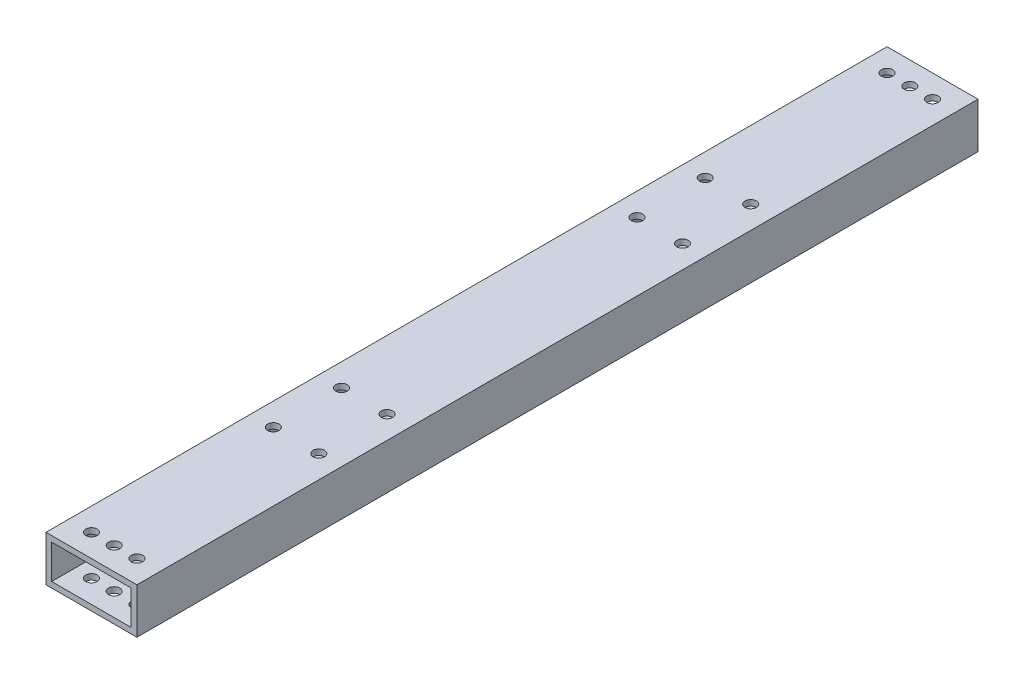
ISO-10303-21;
HEADER;
FILE_DESCRIPTION(('STEP AP214'),'2;1');
FILE_NAME('part.step','',(''),(''),'','','');
FILE_SCHEMA(('AUTOMOTIVE_DESIGN { 1 0 10303 214 1 1 1 1 }'));
ENDSEC;
DATA;
#1=APPLICATION_CONTEXT('core data for automotive mechanical design processes');
#2=APPLICATION_PROTOCOL_DEFINITION('international standard','automotive_design',2000,#1);
#3=PRODUCT_CONTEXT('',#1,'mechanical');
#4=PRODUCT('Part','Part','',(#3));
#5=PRODUCT_RELATED_PRODUCT_CATEGORY('part','',(#4));
#6=PRODUCT_DEFINITION_FORMATION('','',#4);
#7=PRODUCT_DEFINITION_CONTEXT('part definition',#1,'design');
#8=PRODUCT_DEFINITION('design','',#6,#7);
#9=PRODUCT_DEFINITION_SHAPE('','',#8);
#10=(LENGTH_UNIT() NAMED_UNIT(*) SI_UNIT(.MILLI.,.METRE.));
#11=(NAMED_UNIT(*) PLANE_ANGLE_UNIT() SI_UNIT($,.RADIAN.));
#12=(NAMED_UNIT(*) SI_UNIT($,.STERADIAN.) SOLID_ANGLE_UNIT());
#13=UNCERTAINTY_MEASURE_WITH_UNIT(LENGTH_MEASURE(1.E-05),#10,'distance_accuracy_value','');
#14=(GEOMETRIC_REPRESENTATION_CONTEXT(3) GLOBAL_UNCERTAINTY_ASSIGNED_CONTEXT((#13)) GLOBAL_UNIT_ASSIGNED_CONTEXT((#10,
#11,#12)) REPRESENTATION_CONTEXT('',''));
#15=CARTESIAN_POINT('',(0.,0.,0.));
#16=DIRECTION('',(0.,0.,1.));
#17=DIRECTION('',(1.,0.,0.));
#18=AXIS2_PLACEMENT_3D('',#15,#16,#17);
#19=CARTESIAN_POINT('',(0.,0.,469.9));
#20=DIRECTION('',(0.,0.,-1.));
#21=DIRECTION('',(-1.,0.,0.));
#22=AXIS2_PLACEMENT_3D('',#19,#20,#21);
#23=PLANE('',#22);
#24=DIRECTION('',(0.,-1.,0.));
#25=VECTOR('',#24,1.);
#26=CARTESIAN_POINT('',(0.,0.,469.9));
#27=LINE('',#26,#25);
#28=CARTESIAN_POINT('',(0.,25.4,469.9));
#29=VERTEX_POINT('',#28);
#30=CARTESIAN_POINT('',(0.,0.,469.9));
#31=VERTEX_POINT('',#30);
#32=EDGE_CURVE('E144',#29,#31,#27,.T.);
#33=ORIENTED_EDGE('',*,*,#32,.T.);
#34=DIRECTION('',(1.,0.,0.));
#35=VECTOR('',#34,1.);
#36=CARTESIAN_POINT('',(0.,0.,469.9));
#37=LINE('',#36,#35);
#38=CARTESIAN_POINT('',(50.8,0.,469.9));
#39=VERTEX_POINT('',#38);
#40=EDGE_CURVE('E147',#31,#39,#37,.T.);
#41=ORIENTED_EDGE('',*,*,#40,.T.);
#42=DIRECTION('',(0.,1.,0.));
#43=VECTOR('',#42,1.);
#44=CARTESIAN_POINT('',(50.8,0.,469.9));
#45=LINE('',#44,#43);
#46=CARTESIAN_POINT('',(50.8,25.4,469.9));
#47=VERTEX_POINT('',#46);
#48=EDGE_CURVE('E150',#39,#47,#45,.T.);
#49=ORIENTED_EDGE('',*,*,#48,.T.);
#50=DIRECTION('',(-1.,0.,0.));
#51=VECTOR('',#50,1.);
#52=CARTESIAN_POINT('',(0.,25.4,469.9));
#53=LINE('',#52,#51);
#54=EDGE_CURVE('E152',#47,#29,#53,.T.);
#55=ORIENTED_EDGE('',*,*,#54,.T.);
#56=EDGE_LOOP('',(#33,#41,#49,#55));
#57=FACE_BOUND('',#56,.T.);
#58=DIRECTION('',(0.,-1.,0.));
#59=VECTOR('',#58,1.);
#60=CARTESIAN_POINT('',(3.175,3.175,469.9));
#61=LINE('',#60,#59);
#62=CARTESIAN_POINT('',(3.175,22.225,469.9));
#63=VERTEX_POINT('',#62);
#64=CARTESIAN_POINT('',(3.175,3.175,469.9));
#65=VERTEX_POINT('',#64);
#66=EDGE_CURVE('E106',#63,#65,#61,.T.);
#67=ORIENTED_EDGE('',*,*,#66,.F.);
#68=DIRECTION('',(-1.,0.,0.));
#69=VECTOR('',#68,1.);
#70=CARTESIAN_POINT('',(3.175,22.225,469.9));
#71=LINE('',#70,#69);
#72=CARTESIAN_POINT('',(47.625,22.225,469.9));
#73=VERTEX_POINT('',#72);
#74=EDGE_CURVE('E128',#73,#63,#71,.T.);
#75=ORIENTED_EDGE('',*,*,#74,.F.);
#76=DIRECTION('',(0.,1.,0.));
#77=VECTOR('',#76,1.);
#78=CARTESIAN_POINT('',(47.625,3.175,469.9));
#79=LINE('',#78,#77);
#80=CARTESIAN_POINT('',(47.625,3.175,469.9));
#81=VERTEX_POINT('',#80);
#82=EDGE_CURVE('E126',#81,#73,#79,.T.);
#83=ORIENTED_EDGE('',*,*,#82,.F.);
#84=DIRECTION('',(1.,0.,0.));
#85=VECTOR('',#84,1.);
#86=CARTESIAN_POINT('',(3.175,3.175,469.9));
#87=LINE('',#86,#85);
#88=EDGE_CURVE('E114',#65,#81,#87,.T.);
#89=ORIENTED_EDGE('',*,*,#88,.F.);
#90=EDGE_LOOP('',(#67,#75,#83,#89));
#91=FACE_BOUND('',#90,.T.);
#92=ADVANCED_FACE('F39',(#57,#91),#23,.F.);
#93=CARTESIAN_POINT('',(0.,0.,0.));
#94=DIRECTION('',(0.,0.,-1.));
#95=DIRECTION('',(-1.,0.,0.));
#96=AXIS2_PLACEMENT_3D('',#93,#94,#95);
#97=PLANE('',#96);
#98=DIRECTION('',(0.,-1.,0.));
#99=VECTOR('',#98,1.);
#100=CARTESIAN_POINT('',(0.,0.,0.));
#101=LINE('',#100,#99);
#102=CARTESIAN_POINT('',(0.,25.4,0.));
#103=VERTEX_POINT('',#102);
#104=CARTESIAN_POINT('',(0.,0.,0.));
#105=VERTEX_POINT('',#104);
#106=EDGE_CURVE('E122',#103,#105,#101,.T.);
#107=ORIENTED_EDGE('',*,*,#106,.F.);
#108=DIRECTION('',(-1.,0.,0.));
#109=VECTOR('',#108,1.);
#110=CARTESIAN_POINT('',(0.,25.4,0.));
#111=LINE('',#110,#109);
#112=CARTESIAN_POINT('',(50.8,25.4,0.));
#113=VERTEX_POINT('',#112);
#114=EDGE_CURVE('E148',#113,#103,#111,.T.);
#115=ORIENTED_EDGE('',*,*,#114,.F.);
#116=DIRECTION('',(0.,1.,0.));
#117=VECTOR('',#116,1.);
#118=CARTESIAN_POINT('',(50.8,0.,0.));
#119=LINE('',#118,#117);
#120=CARTESIAN_POINT('',(50.8,0.,0.));
#121=VERTEX_POINT('',#120);
#122=EDGE_CURVE('E159',#121,#113,#119,.T.);
#123=ORIENTED_EDGE('',*,*,#122,.F.);
#124=DIRECTION('',(1.,0.,0.));
#125=VECTOR('',#124,1.);
#126=CARTESIAN_POINT('',(0.,0.,0.));
#127=LINE('',#126,#125);
#128=EDGE_CURVE('E157',#105,#121,#127,.T.);
#129=ORIENTED_EDGE('',*,*,#128,.F.);
#130=EDGE_LOOP('',(#107,#115,#123,#129));
#131=FACE_BOUND('',#130,.T.);
#132=DIRECTION('',(-1.,0.,0.));
#133=VECTOR('',#132,1.);
#134=CARTESIAN_POINT('',(3.175,22.225,0.));
#135=LINE('',#134,#133);
#136=CARTESIAN_POINT('',(47.625,22.225,0.));
#137=VERTEX_POINT('',#136);
#138=CARTESIAN_POINT('',(3.175,22.225,0.));
#139=VERTEX_POINT('',#138);
#140=EDGE_CURVE('E115',#137,#139,#135,.T.);
#141=ORIENTED_EDGE('',*,*,#140,.T.);
#142=DIRECTION('',(0.,-1.,0.));
#143=VECTOR('',#142,1.);
#144=CARTESIAN_POINT('',(3.175,3.175,0.));
#145=LINE('',#144,#143);
#146=CARTESIAN_POINT('',(3.175,3.175,0.));
#147=VERTEX_POINT('',#146);
#148=EDGE_CURVE('E64',#139,#147,#145,.T.);
#149=ORIENTED_EDGE('',*,*,#148,.T.);
#150=DIRECTION('',(1.,0.,0.));
#151=VECTOR('',#150,1.);
#152=CARTESIAN_POINT('',(3.175,3.175,0.));
#153=LINE('',#152,#151);
#154=CARTESIAN_POINT('',(47.625,3.175,0.));
#155=VERTEX_POINT('',#154);
#156=EDGE_CURVE('E121',#147,#155,#153,.T.);
#157=ORIENTED_EDGE('',*,*,#156,.T.);
#158=DIRECTION('',(0.,1.,0.));
#159=VECTOR('',#158,1.);
#160=CARTESIAN_POINT('',(47.625,3.175,0.));
#161=LINE('',#160,#159);
#162=EDGE_CURVE('E136',#155,#137,#161,.T.);
#163=ORIENTED_EDGE('',*,*,#162,.T.);
#164=EDGE_LOOP('',(#141,#149,#157,#163));
#165=FACE_BOUND('',#164,.T.);
#166=ADVANCED_FACE('F335',(#131,#165),#97,.T.);
#167=CARTESIAN_POINT('',(0.,0.,469.9));
#168=DIRECTION('',(1.,0.,0.));
#169=DIRECTION('',(0.,0.,-1.));
#170=AXIS2_PLACEMENT_3D('',#167,#168,#169);
#171=PLANE('',#170);
#172=ORIENTED_EDGE('',*,*,#106,.T.);
#173=DIRECTION('',(0.,0.,-1.));
#174=VECTOR('',#173,1.);
#175=CARTESIAN_POINT('',(0.,0.,469.9));
#176=LINE('',#175,#174);
#177=EDGE_CURVE('E11',#31,#105,#176,.T.);
#178=ORIENTED_EDGE('',*,*,#177,.F.);
#179=ORIENTED_EDGE('',*,*,#32,.F.);
#180=DIRECTION('',(0.,0.,-1.));
#181=VECTOR('',#180,1.);
#182=CARTESIAN_POINT('',(0.,25.4,469.9));
#183=LINE('',#182,#181);
#184=EDGE_CURVE('E154',#29,#103,#183,.T.);
#185=ORIENTED_EDGE('',*,*,#184,.T.);
#186=EDGE_LOOP('',(#172,#178,#179,#185));
#187=FACE_BOUND('',#186,.T.);
#188=ADVANCED_FACE('F41',(#187),#171,.F.);
#189=CARTESIAN_POINT('',(0.,0.,469.9));
#190=DIRECTION('',(0.,1.,0.));
#191=DIRECTION('',(0.,0.,1.));
#192=AXIS2_PLACEMENT_3D('',#189,#190,#191);
#193=PLANE('',#192);
#194=CARTESIAN_POINT('',(38.1,0.,114.3));
#195=DIRECTION('',(0.,1.,0.));
#196=DIRECTION('',(0.,0.,-1.));
#197=AXIS2_PLACEMENT_3D('',#194,#195,#196);
#198=CIRCLE('',#197,3.175);
#199=CARTESIAN_POINT('',(38.1,0.,111.125));
#200=VERTEX_POINT('',#199);
#201=EDGE_CURVE('E683',#200,#200,#198,.T.);
#202=ORIENTED_EDGE('',*,*,#201,.T.);
#203=EDGE_LOOP('',(#202));
#204=FACE_BOUND('',#203,.T.);
#205=CARTESIAN_POINT('',(12.7,0.,355.6));
#206=DIRECTION('',(0.,1.,0.));
#207=DIRECTION('',(0.,0.,1.));
#208=AXIS2_PLACEMENT_3D('',#205,#206,#207);
#209=CIRCLE('',#208,3.175);
#210=CARTESIAN_POINT('',(12.7,0.,358.775));
#211=VERTEX_POINT('',#210);
#212=EDGE_CURVE('E684',#211,#211,#209,.T.);
#213=ORIENTED_EDGE('',*,*,#212,.T.);
#214=EDGE_LOOP('',(#213));
#215=FACE_BOUND('',#214,.T.);
#216=CARTESIAN_POINT('',(12.7,0.,317.5));
#217=DIRECTION('',(0.,1.,0.));
#218=DIRECTION('',(0.,0.,1.));
#219=AXIS2_PLACEMENT_3D('',#216,#217,#218);
#220=CIRCLE('',#219,3.175);
#221=CARTESIAN_POINT('',(12.7,0.,320.675));
#222=VERTEX_POINT('',#221);
#223=EDGE_CURVE('E688',#222,#222,#220,.T.);
#224=ORIENTED_EDGE('',*,*,#223,.T.);
#225=EDGE_LOOP('',(#224));
#226=FACE_BOUND('',#225,.T.);
#227=CARTESIAN_POINT('',(12.7,0.,152.4));
#228=DIRECTION('',(0.,1.,0.));
#229=DIRECTION('',(0.,0.,1.));
#230=AXIS2_PLACEMENT_3D('',#227,#228,#229);
#231=CIRCLE('',#230,3.175);
#232=CARTESIAN_POINT('',(12.7,0.,155.575));
#233=VERTEX_POINT('',#232);
#234=EDGE_CURVE('E695',#233,#233,#231,.T.);
#235=ORIENTED_EDGE('',*,*,#234,.T.);
#236=EDGE_LOOP('',(#235));
#237=FACE_BOUND('',#236,.T.);
#238=CARTESIAN_POINT('',(38.1,0.,152.4));
#239=DIRECTION('',(0.,1.,0.));
#240=DIRECTION('',(0.,0.,-1.));
#241=AXIS2_PLACEMENT_3D('',#238,#239,#240);
#242=CIRCLE('',#241,3.175);
#243=CARTESIAN_POINT('',(38.1,0.,149.225));
#244=VERTEX_POINT('',#243);
#245=EDGE_CURVE('E685',#244,#244,#242,.T.);
#246=ORIENTED_EDGE('',*,*,#245,.T.);
#247=EDGE_LOOP('',(#246));
#248=FACE_BOUND('',#247,.T.);
#249=CARTESIAN_POINT('',(38.1000000000001,0.,317.5));
#250=DIRECTION('',(0.,1.,0.));
#251=DIRECTION('',(0.,0.,-1.));
#252=AXIS2_PLACEMENT_3D('',#249,#250,#251);
#253=CIRCLE('',#252,3.175);
#254=CARTESIAN_POINT('',(38.1000000000001,0.,314.325));
#255=VERTEX_POINT('',#254);
#256=EDGE_CURVE('E691',#255,#255,#253,.T.);
#257=ORIENTED_EDGE('',*,*,#256,.T.);
#258=EDGE_LOOP('',(#257));
#259=FACE_BOUND('',#258,.T.);
#260=CARTESIAN_POINT('',(38.1000000000001,0.,355.6));
#261=DIRECTION('',(0.,1.,0.));
#262=DIRECTION('',(0.,0.,-1.));
#263=AXIS2_PLACEMENT_3D('',#260,#261,#262);
#264=CIRCLE('',#263,3.175);
#265=CARTESIAN_POINT('',(38.1000000000001,0.,352.425));
#266=VERTEX_POINT('',#265);
#267=EDGE_CURVE('E784',#266,#266,#264,.T.);
#268=ORIENTED_EDGE('',*,*,#267,.T.);
#269=EDGE_LOOP('',(#268));
#270=FACE_BOUND('',#269,.T.);
#271=CARTESIAN_POINT('',(12.7,0.,114.3));
#272=DIRECTION('',(0.,1.,0.));
#273=DIRECTION('',(0.,0.,1.));
#274=AXIS2_PLACEMENT_3D('',#271,#272,#273);
#275=CIRCLE('',#274,3.175);
#276=CARTESIAN_POINT('',(12.7,0.,117.475));
#277=VERTEX_POINT('',#276);
#278=EDGE_CURVE('E197',#277,#277,#275,.T.);
#279=ORIENTED_EDGE('',*,*,#278,.T.);
#280=EDGE_LOOP('',(#279));
#281=FACE_BOUND('',#280,.T.);
#282=CARTESIAN_POINT('',(38.0999999999999,0.,12.6999999999999));
#283=DIRECTION('',(0.,1.,0.));
#284=DIRECTION('',(0.,0.,1.));
#285=AXIS2_PLACEMENT_3D('',#282,#283,#284);
#286=CIRCLE('',#285,3.175);
#287=CARTESIAN_POINT('',(38.0999999999999,0.,15.8749999999999));
#288=VERTEX_POINT('',#287);
#289=EDGE_CURVE('E251',#288,#288,#286,.T.);
#290=ORIENTED_EDGE('',*,*,#289,.T.);
#291=EDGE_LOOP('',(#290));
#292=FACE_BOUND('',#291,.T.);
#293=CARTESIAN_POINT('',(25.4,0.,457.2));
#294=DIRECTION('',(0.,1.,0.));
#295=DIRECTION('',(0.,0.,1.));
#296=AXIS2_PLACEMENT_3D('',#293,#294,#295);
#297=CIRCLE('',#296,3.175);
#298=CARTESIAN_POINT('',(25.4,0.,460.375));
#299=VERTEX_POINT('',#298);
#300=EDGE_CURVE('E258',#299,#299,#297,.T.);
#301=ORIENTED_EDGE('',*,*,#300,.T.);
#302=EDGE_LOOP('',(#301));
#303=FACE_BOUND('',#302,.T.);
#304=CARTESIAN_POINT('',(25.3999999999999,0.,12.6999999999999));
#305=DIRECTION('',(0.,1.,0.));
#306=DIRECTION('',(0.,0.,1.));
#307=AXIS2_PLACEMENT_3D('',#304,#305,#306);
#308=CIRCLE('',#307,3.175);
#309=CARTESIAN_POINT('',(25.3999999999999,0.,15.8749999999999));
#310=VERTEX_POINT('',#309);
#311=EDGE_CURVE('E257',#310,#310,#308,.T.);
#312=ORIENTED_EDGE('',*,*,#311,.T.);
#313=EDGE_LOOP('',(#312));
#314=FACE_BOUND('',#313,.T.);
#315=CARTESIAN_POINT('',(12.7,0.,457.2));
#316=DIRECTION('',(0.,1.,0.));
#317=DIRECTION('',(0.,0.,1.));
#318=AXIS2_PLACEMENT_3D('',#315,#316,#317);
#319=CIRCLE('',#318,3.175);
#320=CARTESIAN_POINT('',(12.7,0.,460.375));
#321=VERTEX_POINT('',#320);
#322=EDGE_CURVE('E270',#321,#321,#319,.T.);
#323=ORIENTED_EDGE('',*,*,#322,.T.);
#324=EDGE_LOOP('',(#323));
#325=FACE_BOUND('',#324,.T.);
#326=CARTESIAN_POINT('',(38.1,0.,457.2));
#327=DIRECTION('',(0.,1.,0.));
#328=DIRECTION('',(0.,0.,1.));
#329=AXIS2_PLACEMENT_3D('',#326,#327,#328);
#330=CIRCLE('',#329,3.175);
#331=CARTESIAN_POINT('',(38.1,0.,460.375));
#332=VERTEX_POINT('',#331);
#333=EDGE_CURVE('E247',#332,#332,#330,.T.);
#334=ORIENTED_EDGE('',*,*,#333,.T.);
#335=EDGE_LOOP('',(#334));
#336=FACE_BOUND('',#335,.T.);
#337=CARTESIAN_POINT('',(12.6999999999999,0.,12.6999999999999));
#338=DIRECTION('',(0.,1.,0.));
#339=DIRECTION('',(0.,0.,1.));
#340=AXIS2_PLACEMENT_3D('',#337,#338,#339);
#341=CIRCLE('',#340,3.175);
#342=CARTESIAN_POINT('',(12.6999999999999,0.,15.8749999999999));
#343=VERTEX_POINT('',#342);
#344=EDGE_CURVE('E173',#343,#343,#341,.T.);
#345=ORIENTED_EDGE('',*,*,#344,.T.);
#346=EDGE_LOOP('',(#345));
#347=FACE_BOUND('',#346,.T.);
#348=ORIENTED_EDGE('',*,*,#128,.T.);
#349=DIRECTION('',(0.,0.,-1.));
#350=VECTOR('',#349,1.);
#351=CARTESIAN_POINT('',(50.8,0.,469.9));
#352=LINE('',#351,#350);
#353=EDGE_CURVE('E48',#39,#121,#352,.T.);
#354=ORIENTED_EDGE('',*,*,#353,.F.);
#355=ORIENTED_EDGE('',*,*,#40,.F.);
#356=ORIENTED_EDGE('',*,*,#177,.T.);
#357=EDGE_LOOP('',(#348,#354,#355,#356));
#358=FACE_BOUND('',#357,.T.);
#359=ADVANCED_FACE('F321',(#204,#215,#226,#237,#248,#259,#270,#281,#292,#303,#314,#325,#336,
#347,#358),#193,.F.);
#360=CARTESIAN_POINT('',(50.8,0.,469.9));
#361=DIRECTION('',(-1.,0.,0.));
#362=DIRECTION('',(0.,0.,1.));
#363=AXIS2_PLACEMENT_3D('',#360,#361,#362);
#364=PLANE('',#363);
#365=ORIENTED_EDGE('',*,*,#122,.T.);
#366=DIRECTION('',(0.,0.,-1.));
#367=VECTOR('',#366,1.);
#368=CARTESIAN_POINT('',(50.8,25.4,469.9));
#369=LINE('',#368,#367);
#370=EDGE_CURVE('E164',#47,#113,#369,.T.);
#371=ORIENTED_EDGE('',*,*,#370,.F.);
#372=ORIENTED_EDGE('',*,*,#48,.F.);
#373=ORIENTED_EDGE('',*,*,#353,.T.);
#374=EDGE_LOOP('',(#365,#371,#372,#373));
#375=FACE_BOUND('',#374,.T.);
#376=ADVANCED_FACE('F324',(#375),#364,.F.);
#377=CARTESIAN_POINT('',(0.,25.4,469.9));
#378=DIRECTION('',(0.,-1.,0.));
#379=DIRECTION('',(0.,0.,-1.));
#380=AXIS2_PLACEMENT_3D('',#377,#378,#379);
#381=PLANE('',#380);
#382=CARTESIAN_POINT('',(38.1,25.4,114.3));
#383=DIRECTION('',(0.,-1.,0.));
#384=DIRECTION('',(0.,0.,-1.));
#385=AXIS2_PLACEMENT_3D('',#382,#383,#384);
#386=CIRCLE('',#385,3.175);
#387=CARTESIAN_POINT('',(38.1,25.4,111.125));
#388=VERTEX_POINT('',#387);
#389=EDGE_CURVE('E244',#388,#388,#386,.T.);
#390=ORIENTED_EDGE('',*,*,#389,.T.);
#391=EDGE_LOOP('',(#390));
#392=FACE_BOUND('',#391,.T.);
#393=CARTESIAN_POINT('',(12.7,25.4,355.6));
#394=DIRECTION('',(0.,-1.,0.));
#395=DIRECTION('',(0.,0.,-1.));
#396=AXIS2_PLACEMENT_3D('',#393,#394,#395);
#397=CIRCLE('',#396,3.175);
#398=CARTESIAN_POINT('',(12.7,25.4,352.425));
#399=VERTEX_POINT('',#398);
#400=EDGE_CURVE('E229',#399,#399,#397,.T.);
#401=ORIENTED_EDGE('',*,*,#400,.T.);
#402=EDGE_LOOP('',(#401));
#403=FACE_BOUND('',#402,.T.);
#404=CARTESIAN_POINT('',(12.7,25.4,317.5));
#405=DIRECTION('',(0.,-1.,0.));
#406=DIRECTION('',(0.,0.,-1.));
#407=AXIS2_PLACEMENT_3D('',#404,#405,#406);
#408=CIRCLE('',#407,3.175);
#409=CARTESIAN_POINT('',(12.7,25.4,314.325));
#410=VERTEX_POINT('',#409);
#411=EDGE_CURVE('E225',#410,#410,#408,.T.);
#412=ORIENTED_EDGE('',*,*,#411,.T.);
#413=EDGE_LOOP('',(#412));
#414=FACE_BOUND('',#413,.T.);
#415=CARTESIAN_POINT('',(12.7,25.4,152.4));
#416=DIRECTION('',(0.,-1.,0.));
#417=DIRECTION('',(0.,0.,-1.));
#418=AXIS2_PLACEMENT_3D('',#415,#416,#417);
#419=CIRCLE('',#418,3.175);
#420=CARTESIAN_POINT('',(12.7,25.4,149.225));
#421=VERTEX_POINT('',#420);
#422=EDGE_CURVE('E221',#421,#421,#419,.T.);
#423=ORIENTED_EDGE('',*,*,#422,.T.);
#424=EDGE_LOOP('',(#423));
#425=FACE_BOUND('',#424,.T.);
#426=CARTESIAN_POINT('',(38.1,25.4,152.4));
#427=DIRECTION('',(0.,-1.,0.));
#428=DIRECTION('',(0.,0.,-1.));
#429=AXIS2_PLACEMENT_3D('',#426,#427,#428);
#430=CIRCLE('',#429,3.175);
#431=CARTESIAN_POINT('',(38.1,25.4,149.225));
#432=VERTEX_POINT('',#431);
#433=EDGE_CURVE('E217',#432,#432,#430,.T.);
#434=ORIENTED_EDGE('',*,*,#433,.T.);
#435=EDGE_LOOP('',(#434));
#436=FACE_BOUND('',#435,.T.);
#437=CARTESIAN_POINT('',(38.1000000000001,25.4,317.5));
#438=DIRECTION('',(0.,-1.,0.));
#439=DIRECTION('',(0.,0.,-1.));
#440=AXIS2_PLACEMENT_3D('',#437,#438,#439);
#441=CIRCLE('',#440,3.175);
#442=CARTESIAN_POINT('',(38.1000000000001,25.4,314.325));
#443=VERTEX_POINT('',#442);
#444=EDGE_CURVE('E212',#443,#443,#441,.T.);
#445=ORIENTED_EDGE('',*,*,#444,.T.);
#446=EDGE_LOOP('',(#445));
#447=FACE_BOUND('',#446,.T.);
#448=CARTESIAN_POINT('',(38.1000000000001,25.4,355.6));
#449=DIRECTION('',(0.,-1.,0.));
#450=DIRECTION('',(0.,0.,-1.));
#451=AXIS2_PLACEMENT_3D('',#448,#449,#450);
#452=CIRCLE('',#451,3.175);
#453=CARTESIAN_POINT('',(38.1000000000001,25.4,352.425));
#454=VERTEX_POINT('',#453);
#455=EDGE_CURVE('E207',#454,#454,#452,.T.);
#456=ORIENTED_EDGE('',*,*,#455,.T.);
#457=EDGE_LOOP('',(#456));
#458=FACE_BOUND('',#457,.T.);
#459=CARTESIAN_POINT('',(12.7,25.4,114.3));
#460=DIRECTION('',(0.,-1.,0.));
#461=DIRECTION('',(0.,0.,-1.));
#462=AXIS2_PLACEMENT_3D('',#459,#460,#461);
#463=CIRCLE('',#462,3.175);
#464=CARTESIAN_POINT('',(12.7,25.4,111.125));
#465=VERTEX_POINT('',#464);
#466=EDGE_CURVE('E202',#465,#465,#463,.T.);
#467=ORIENTED_EDGE('',*,*,#466,.T.);
#468=EDGE_LOOP('',(#467));
#469=FACE_BOUND('',#468,.T.);
#470=CARTESIAN_POINT('',(38.0999999999999,25.4,12.6999999999999));
#471=DIRECTION('',(0.,1.,0.));
#472=DIRECTION('',(0.,0.,1.));
#473=AXIS2_PLACEMENT_3D('',#470,#471,#472);
#474=CIRCLE('',#473,3.175);
#475=CARTESIAN_POINT('',(38.0999999999999,25.4,15.8749999999999));
#476=VERTEX_POINT('',#475);
#477=EDGE_CURVE('E261',#476,#476,#474,.T.);
#478=ORIENTED_EDGE('',*,*,#477,.F.);
#479=EDGE_LOOP('',(#478));
#480=FACE_BOUND('',#479,.T.);
#481=CARTESIAN_POINT('',(25.4,25.4,457.2));
#482=DIRECTION('',(0.,1.,0.));
#483=DIRECTION('',(0.,0.,1.));
#484=AXIS2_PLACEMENT_3D('',#481,#482,#483);
#485=CIRCLE('',#484,3.175);
#486=CARTESIAN_POINT('',(25.4,25.4,460.375));
#487=VERTEX_POINT('',#486);
#488=EDGE_CURVE('E254',#487,#487,#485,.T.);
#489=ORIENTED_EDGE('',*,*,#488,.F.);
#490=EDGE_LOOP('',(#489));
#491=FACE_BOUND('',#490,.T.);
#492=CARTESIAN_POINT('',(25.3999999999999,25.4,12.6999999999999));
#493=DIRECTION('',(0.,1.,0.));
#494=DIRECTION('',(0.,0.,1.));
#495=AXIS2_PLACEMENT_3D('',#492,#493,#494);
#496=CIRCLE('',#495,3.175);
#497=CARTESIAN_POINT('',(25.3999999999999,25.4,15.8749999999999));
#498=VERTEX_POINT('',#497);
#499=EDGE_CURVE('E273',#498,#498,#496,.T.);
#500=ORIENTED_EDGE('',*,*,#499,.F.);
#501=EDGE_LOOP('',(#500));
#502=FACE_BOUND('',#501,.T.);
#503=CARTESIAN_POINT('',(12.7,25.4,457.2));
#504=DIRECTION('',(0.,1.,0.));
#505=DIRECTION('',(0.,0.,1.));
#506=AXIS2_PLACEMENT_3D('',#503,#504,#505);
#507=CIRCLE('',#506,3.175);
#508=CARTESIAN_POINT('',(12.7,25.4,460.375));
#509=VERTEX_POINT('',#508);
#510=EDGE_CURVE('E266',#509,#509,#507,.T.);
#511=ORIENTED_EDGE('',*,*,#510,.F.);
#512=EDGE_LOOP('',(#511));
#513=FACE_BOUND('',#512,.T.);
#514=CARTESIAN_POINT('',(38.1,25.4,457.2));
#515=DIRECTION('',(0.,1.,0.));
#516=DIRECTION('',(0.,0.,1.));
#517=AXIS2_PLACEMENT_3D('',#514,#515,#516);
#518=CIRCLE('',#517,3.175);
#519=CARTESIAN_POINT('',(38.1,25.4,460.375));
#520=VERTEX_POINT('',#519);
#521=EDGE_CURVE('E248',#520,#520,#518,.T.);
#522=ORIENTED_EDGE('',*,*,#521,.F.);
#523=EDGE_LOOP('',(#522));
#524=FACE_BOUND('',#523,.T.);
#525=CARTESIAN_POINT('',(12.6999999999999,25.4,12.6999999999999));
#526=DIRECTION('',(0.,1.,0.));
#527=DIRECTION('',(0.,0.,1.));
#528=AXIS2_PLACEMENT_3D('',#525,#526,#527);
#529=CIRCLE('',#528,3.175);
#530=CARTESIAN_POINT('',(12.6999999999999,25.4,15.8749999999999));
#531=VERTEX_POINT('',#530);
#532=EDGE_CURVE('E269',#531,#531,#529,.T.);
#533=ORIENTED_EDGE('',*,*,#532,.F.);
#534=EDGE_LOOP('',(#533));
#535=FACE_BOUND('',#534,.T.);
#536=ORIENTED_EDGE('',*,*,#114,.T.);
#537=ORIENTED_EDGE('',*,*,#184,.F.);
#538=ORIENTED_EDGE('',*,*,#54,.F.);
#539=ORIENTED_EDGE('',*,*,#370,.T.);
#540=EDGE_LOOP('',(#536,#537,#538,#539));
#541=FACE_BOUND('',#540,.T.);
#542=ADVANCED_FACE('F339',(#392,#403,#414,#425,#436,#447,#458,#469,#480,#491,#502,#513,#524,
#535,#541),#381,.F.);
#543=CARTESIAN_POINT('',(3.175,3.175,469.9));
#544=DIRECTION('',(1.,0.,0.));
#545=DIRECTION('',(0.,0.,-1.));
#546=AXIS2_PLACEMENT_3D('',#543,#544,#545);
#547=PLANE('',#546);
#548=ORIENTED_EDGE('',*,*,#148,.F.);
#549=DIRECTION('',(0.,0.,-1.));
#550=VECTOR('',#549,1.);
#551=CARTESIAN_POINT('',(3.175,22.225,469.9));
#552=LINE('',#551,#550);
#553=EDGE_CURVE('E110',#63,#139,#552,.T.);
#554=ORIENTED_EDGE('',*,*,#553,.F.);
#555=ORIENTED_EDGE('',*,*,#66,.T.);
#556=DIRECTION('',(0.,0.,-1.));
#557=VECTOR('',#556,1.);
#558=CARTESIAN_POINT('',(3.175,3.175,469.9));
#559=LINE('',#558,#557);
#560=EDGE_CURVE('E109',#65,#147,#559,.T.);
#561=ORIENTED_EDGE('',*,*,#560,.T.);
#562=EDGE_LOOP('',(#548,#554,#555,#561));
#563=FACE_BOUND('',#562,.T.);
#564=ADVANCED_FACE('F108',(#563),#547,.T.);
#565=CARTESIAN_POINT('',(3.175,3.175,469.9));
#566=DIRECTION('',(0.,1.,0.));
#567=DIRECTION('',(0.,0.,1.));
#568=AXIS2_PLACEMENT_3D('',#565,#566,#567);
#569=PLANE('',#568);
#570=CARTESIAN_POINT('',(38.1,3.175,114.3));
#571=DIRECTION('',(0.,1.,0.));
#572=DIRECTION('',(0.,0.,1.));
#573=AXIS2_PLACEMENT_3D('',#570,#571,#572);
#574=CIRCLE('',#573,3.175);
#575=CARTESIAN_POINT('',(38.1,3.175,117.475));
#576=VERTEX_POINT('',#575);
#577=EDGE_CURVE('E241',#576,#576,#574,.T.);
#578=ORIENTED_EDGE('',*,*,#577,.F.);
#579=EDGE_LOOP('',(#578));
#580=FACE_BOUND('',#579,.T.);
#581=CARTESIAN_POINT('',(12.7,3.175,355.6));
#582=DIRECTION('',(0.,1.,0.));
#583=DIRECTION('',(0.,0.,1.));
#584=AXIS2_PLACEMENT_3D('',#581,#582,#583);
#585=CIRCLE('',#584,3.175);
#586=CARTESIAN_POINT('',(12.7,3.175,358.775));
#587=VERTEX_POINT('',#586);
#588=EDGE_CURVE('E224',#587,#587,#585,.T.);
#589=ORIENTED_EDGE('',*,*,#588,.F.);
#590=EDGE_LOOP('',(#589));
#591=FACE_BOUND('',#590,.T.);
#592=CARTESIAN_POINT('',(12.7,3.175,317.5));
#593=DIRECTION('',(0.,1.,0.));
#594=DIRECTION('',(0.,0.,1.));
#595=AXIS2_PLACEMENT_3D('',#592,#593,#594);
#596=CIRCLE('',#595,3.175);
#597=CARTESIAN_POINT('',(12.7,3.175,320.675));
#598=VERTEX_POINT('',#597);
#599=EDGE_CURVE('E220',#598,#598,#596,.T.);
#600=ORIENTED_EDGE('',*,*,#599,.F.);
#601=EDGE_LOOP('',(#600));
#602=FACE_BOUND('',#601,.T.);
#603=CARTESIAN_POINT('',(12.7,3.175,152.4));
#604=DIRECTION('',(0.,1.,0.));
#605=DIRECTION('',(0.,0.,1.));
#606=AXIS2_PLACEMENT_3D('',#603,#604,#605);
#607=CIRCLE('',#606,3.175);
#608=CARTESIAN_POINT('',(12.7,3.175,155.575));
#609=VERTEX_POINT('',#608);
#610=EDGE_CURVE('E216',#609,#609,#607,.T.);
#611=ORIENTED_EDGE('',*,*,#610,.F.);
#612=EDGE_LOOP('',(#611));
#613=FACE_BOUND('',#612,.T.);
#614=CARTESIAN_POINT('',(38.1,3.175,152.4));
#615=DIRECTION('',(0.,1.,0.));
#616=DIRECTION('',(0.,0.,1.));
#617=AXIS2_PLACEMENT_3D('',#614,#615,#616);
#618=CIRCLE('',#617,3.175);
#619=CARTESIAN_POINT('',(38.1,3.175,155.575));
#620=VERTEX_POINT('',#619);
#621=EDGE_CURVE('E211',#620,#620,#618,.T.);
#622=ORIENTED_EDGE('',*,*,#621,.F.);
#623=EDGE_LOOP('',(#622));
#624=FACE_BOUND('',#623,.T.);
#625=CARTESIAN_POINT('',(38.1000000000001,3.175,317.5));
#626=DIRECTION('',(0.,1.,0.));
#627=DIRECTION('',(0.,0.,1.));
#628=AXIS2_PLACEMENT_3D('',#625,#626,#627);
#629=CIRCLE('',#628,3.175);
#630=CARTESIAN_POINT('',(38.1000000000001,3.175,320.675));
#631=VERTEX_POINT('',#630);
#632=EDGE_CURVE('E206',#631,#631,#629,.T.);
#633=ORIENTED_EDGE('',*,*,#632,.F.);
#634=EDGE_LOOP('',(#633));
#635=FACE_BOUND('',#634,.T.);
#636=CARTESIAN_POINT('',(38.1000000000001,3.175,355.6));
#637=DIRECTION('',(0.,1.,0.));
#638=DIRECTION('',(0.,0.,1.));
#639=AXIS2_PLACEMENT_3D('',#636,#637,#638);
#640=CIRCLE('',#639,3.175);
#641=CARTESIAN_POINT('',(38.1000000000001,3.175,358.775));
#642=VERTEX_POINT('',#641);
#643=EDGE_CURVE('E201',#642,#642,#640,.T.);
#644=ORIENTED_EDGE('',*,*,#643,.F.);
#645=EDGE_LOOP('',(#644));
#646=FACE_BOUND('',#645,.T.);
#647=CARTESIAN_POINT('',(12.7,3.175,114.3));
#648=DIRECTION('',(0.,1.,0.));
#649=DIRECTION('',(0.,0.,1.));
#650=AXIS2_PLACEMENT_3D('',#647,#648,#649);
#651=CIRCLE('',#650,3.175);
#652=CARTESIAN_POINT('',(12.7,3.175,117.475));
#653=VERTEX_POINT('',#652);
#654=EDGE_CURVE('E196',#653,#653,#651,.T.);
#655=ORIENTED_EDGE('',*,*,#654,.F.);
#656=EDGE_LOOP('',(#655));
#657=FACE_BOUND('',#656,.T.);
#658=CARTESIAN_POINT('',(38.0999999999999,3.175,12.6999999999999));
#659=DIRECTION('',(0.,1.,0.));
#660=DIRECTION('',(0.,0.,1.));
#661=AXIS2_PLACEMENT_3D('',#658,#659,#660);
#662=CIRCLE('',#661,3.175);
#663=CARTESIAN_POINT('',(38.0999999999999,3.175,15.8749999999999));
#664=VERTEX_POINT('',#663);
#665=EDGE_CURVE('E134',#664,#664,#662,.T.);
#666=ORIENTED_EDGE('',*,*,#665,.F.);
#667=EDGE_LOOP('',(#666));
#668=FACE_BOUND('',#667,.T.);
#669=CARTESIAN_POINT('',(25.4,3.175,457.2));
#670=DIRECTION('',(0.,1.,0.));
#671=DIRECTION('',(0.,0.,1.));
#672=AXIS2_PLACEMENT_3D('',#669,#670,#671);
#673=CIRCLE('',#672,3.175);
#674=CARTESIAN_POINT('',(25.4,3.175,460.375));
#675=VERTEX_POINT('',#674);
#676=EDGE_CURVE('E189',#675,#675,#673,.T.);
#677=ORIENTED_EDGE('',*,*,#676,.F.);
#678=EDGE_LOOP('',(#677));
#679=FACE_BOUND('',#678,.T.);
#680=CARTESIAN_POINT('',(25.3999999999999,3.175,12.6999999999999));
#681=DIRECTION('',(0.,1.,0.));
#682=DIRECTION('',(0.,0.,1.));
#683=AXIS2_PLACEMENT_3D('',#680,#681,#682);
#684=CIRCLE('',#683,3.175);
#685=CARTESIAN_POINT('',(25.3999999999999,3.175,15.8749999999999));
#686=VERTEX_POINT('',#685);
#687=EDGE_CURVE('E185',#686,#686,#684,.T.);
#688=ORIENTED_EDGE('',*,*,#687,.F.);
#689=EDGE_LOOP('',(#688));
#690=FACE_BOUND('',#689,.T.);
#691=CARTESIAN_POINT('',(12.7,3.175,457.2));
#692=DIRECTION('',(0.,1.,0.));
#693=DIRECTION('',(0.,0.,1.));
#694=AXIS2_PLACEMENT_3D('',#691,#692,#693);
#695=CIRCLE('',#694,3.175);
#696=CARTESIAN_POINT('',(12.7,3.175,460.375));
#697=VERTEX_POINT('',#696);
#698=EDGE_CURVE('E181',#697,#697,#695,.T.);
#699=ORIENTED_EDGE('',*,*,#698,.F.);
#700=EDGE_LOOP('',(#699));
#701=FACE_BOUND('',#700,.T.);
#702=CARTESIAN_POINT('',(38.1,3.175,457.2));
#703=DIRECTION('',(0.,1.,0.));
#704=DIRECTION('',(0.,0.,1.));
#705=AXIS2_PLACEMENT_3D('',#702,#703,#704);
#706=CIRCLE('',#705,3.175);
#707=CARTESIAN_POINT('',(38.1,3.175,460.375));
#708=VERTEX_POINT('',#707);
#709=EDGE_CURVE('E177',#708,#708,#706,.T.);
#710=ORIENTED_EDGE('',*,*,#709,.F.);
#711=EDGE_LOOP('',(#710));
#712=FACE_BOUND('',#711,.T.);
#713=CARTESIAN_POINT('',(12.6999999999999,3.175,12.6999999999999));
#714=DIRECTION('',(0.,1.,0.));
#715=DIRECTION('',(0.,0.,1.));
#716=AXIS2_PLACEMENT_3D('',#713,#714,#715);
#717=CIRCLE('',#716,3.175);
#718=CARTESIAN_POINT('',(12.6999999999999,3.175,15.8749999999999));
#719=VERTEX_POINT('',#718);
#720=EDGE_CURVE('E172',#719,#719,#717,.T.);
#721=ORIENTED_EDGE('',*,*,#720,.F.);
#722=EDGE_LOOP('',(#721));
#723=FACE_BOUND('',#722,.T.);
#724=ORIENTED_EDGE('',*,*,#156,.F.);
#725=ORIENTED_EDGE('',*,*,#560,.F.);
#726=ORIENTED_EDGE('',*,*,#88,.T.);
#727=DIRECTION('',(0.,0.,-1.));
#728=VECTOR('',#727,1.);
#729=CARTESIAN_POINT('',(47.625,3.175,469.9));
#730=LINE('',#729,#728);
#731=EDGE_CURVE('E123',#81,#155,#730,.T.);
#732=ORIENTED_EDGE('',*,*,#731,.T.);
#733=EDGE_LOOP('',(#724,#725,#726,#732));
#734=FACE_BOUND('',#733,.T.);
#735=ADVANCED_FACE('F118',(#580,#591,#602,#613,#624,#635,#646,#657,#668,#679,#690,#701,#712,
#723,#734),#569,.T.);
#736=CARTESIAN_POINT('',(47.625,3.175,469.9));
#737=DIRECTION('',(-1.,0.,0.));
#738=DIRECTION('',(0.,0.,1.));
#739=AXIS2_PLACEMENT_3D('',#736,#737,#738);
#740=PLANE('',#739);
#741=ORIENTED_EDGE('',*,*,#162,.F.);
#742=ORIENTED_EDGE('',*,*,#731,.F.);
#743=ORIENTED_EDGE('',*,*,#82,.T.);
#744=DIRECTION('',(0.,0.,-1.));
#745=VECTOR('',#744,1.);
#746=CARTESIAN_POINT('',(47.625,22.225,469.9));
#747=LINE('',#746,#745);
#748=EDGE_CURVE('E56',#73,#137,#747,.T.);
#749=ORIENTED_EDGE('',*,*,#748,.T.);
#750=EDGE_LOOP('',(#741,#742,#743,#749));
#751=FACE_BOUND('',#750,.T.);
#752=ADVANCED_FACE('F299',(#751),#740,.T.);
#753=CARTESIAN_POINT('',(3.175,22.225,469.9));
#754=DIRECTION('',(0.,-1.,0.));
#755=DIRECTION('',(0.,0.,-1.));
#756=AXIS2_PLACEMENT_3D('',#753,#754,#755);
#757=PLANE('',#756);
#758=CARTESIAN_POINT('',(38.1,22.225,114.3));
#759=DIRECTION('',(0.,-1.,0.));
#760=DIRECTION('',(0.,0.,-1.));
#761=AXIS2_PLACEMENT_3D('',#758,#759,#760);
#762=CIRCLE('',#761,3.175);
#763=CARTESIAN_POINT('',(38.1,22.225,111.125));
#764=VERTEX_POINT('',#763);
#765=EDGE_CURVE('E43',#764,#764,#762,.T.);
#766=ORIENTED_EDGE('',*,*,#765,.F.);
#767=EDGE_LOOP('',(#766));
#768=FACE_BOUND('',#767,.T.);
#769=CARTESIAN_POINT('',(12.7,22.225,355.6));
#770=DIRECTION('',(0.,-1.,0.));
#771=DIRECTION('',(0.,0.,-1.));
#772=AXIS2_PLACEMENT_3D('',#769,#770,#771);
#773=CIRCLE('',#772,3.175);
#774=CARTESIAN_POINT('',(12.7,22.225,352.425));
#775=VERTEX_POINT('',#774);
#776=EDGE_CURVE('E222',#775,#775,#773,.T.);
#777=ORIENTED_EDGE('',*,*,#776,.F.);
#778=EDGE_LOOP('',(#777));
#779=FACE_BOUND('',#778,.T.);
#780=CARTESIAN_POINT('',(12.7,22.225,317.5));
#781=DIRECTION('',(0.,-1.,0.));
#782=DIRECTION('',(0.,0.,-1.));
#783=AXIS2_PLACEMENT_3D('',#780,#781,#782);
#784=CIRCLE('',#783,3.175);
#785=CARTESIAN_POINT('',(12.7,22.225,314.325));
#786=VERTEX_POINT('',#785);
#787=EDGE_CURVE('E218',#786,#786,#784,.T.);
#788=ORIENTED_EDGE('',*,*,#787,.F.);
#789=EDGE_LOOP('',(#788));
#790=FACE_BOUND('',#789,.T.);
#791=CARTESIAN_POINT('',(12.7,22.225,152.4));
#792=DIRECTION('',(0.,-1.,0.));
#793=DIRECTION('',(0.,0.,-1.));
#794=AXIS2_PLACEMENT_3D('',#791,#792,#793);
#795=CIRCLE('',#794,3.175);
#796=CARTESIAN_POINT('',(12.7,22.225,149.225));
#797=VERTEX_POINT('',#796);
#798=EDGE_CURVE('E213',#797,#797,#795,.T.);
#799=ORIENTED_EDGE('',*,*,#798,.F.);
#800=EDGE_LOOP('',(#799));
#801=FACE_BOUND('',#800,.T.);
#802=CARTESIAN_POINT('',(38.1,22.225,152.4));
#803=DIRECTION('',(0.,-1.,0.));
#804=DIRECTION('',(0.,0.,-1.));
#805=AXIS2_PLACEMENT_3D('',#802,#803,#804);
#806=CIRCLE('',#805,3.175);
#807=CARTESIAN_POINT('',(38.1,22.225,149.225));
#808=VERTEX_POINT('',#807);
#809=EDGE_CURVE('E208',#808,#808,#806,.T.);
#810=ORIENTED_EDGE('',*,*,#809,.F.);
#811=EDGE_LOOP('',(#810));
#812=FACE_BOUND('',#811,.T.);
#813=CARTESIAN_POINT('',(38.1000000000001,22.225,317.5));
#814=DIRECTION('',(0.,-1.,0.));
#815=DIRECTION('',(0.,0.,-1.));
#816=AXIS2_PLACEMENT_3D('',#813,#814,#815);
#817=CIRCLE('',#816,3.175);
#818=CARTESIAN_POINT('',(38.1000000000001,22.225,314.325));
#819=VERTEX_POINT('',#818);
#820=EDGE_CURVE('E203',#819,#819,#817,.T.);
#821=ORIENTED_EDGE('',*,*,#820,.F.);
#822=EDGE_LOOP('',(#821));
#823=FACE_BOUND('',#822,.T.);
#824=CARTESIAN_POINT('',(38.1000000000001,22.225,355.6));
#825=DIRECTION('',(0.,-1.,0.));
#826=DIRECTION('',(0.,0.,-1.));
#827=AXIS2_PLACEMENT_3D('',#824,#825,#826);
#828=CIRCLE('',#827,3.175);
#829=CARTESIAN_POINT('',(38.1000000000001,22.225,352.425));
#830=VERTEX_POINT('',#829);
#831=EDGE_CURVE('E198',#830,#830,#828,.T.);
#832=ORIENTED_EDGE('',*,*,#831,.F.);
#833=EDGE_LOOP('',(#832));
#834=FACE_BOUND('',#833,.T.);
#835=CARTESIAN_POINT('',(12.7,22.225,114.3));
#836=DIRECTION('',(0.,-1.,0.));
#837=DIRECTION('',(0.,0.,-1.));
#838=AXIS2_PLACEMENT_3D('',#835,#836,#837);
#839=CIRCLE('',#838,3.175);
#840=CARTESIAN_POINT('',(12.7,22.225,111.125));
#841=VERTEX_POINT('',#840);
#842=EDGE_CURVE('E193',#841,#841,#839,.T.);
#843=ORIENTED_EDGE('',*,*,#842,.F.);
#844=EDGE_LOOP('',(#843));
#845=FACE_BOUND('',#844,.T.);
#846=CARTESIAN_POINT('',(38.0999999999999,22.225,12.6999999999999));
#847=DIRECTION('',(0.,-1.,0.));
#848=DIRECTION('',(0.,0.,-1.));
#849=AXIS2_PLACEMENT_3D('',#846,#847,#848);
#850=CIRCLE('',#849,3.175);
#851=CARTESIAN_POINT('',(38.0999999999999,22.225,9.52499999999992));
#852=VERTEX_POINT('',#851);
#853=EDGE_CURVE('E190',#852,#852,#850,.T.);
#854=ORIENTED_EDGE('',*,*,#853,.F.);
#855=EDGE_LOOP('',(#854));
#856=FACE_BOUND('',#855,.T.);
#857=CARTESIAN_POINT('',(25.4,22.225,457.2));
#858=DIRECTION('',(0.,-1.,0.));
#859=DIRECTION('',(0.,0.,-1.));
#860=AXIS2_PLACEMENT_3D('',#857,#858,#859);
#861=CIRCLE('',#860,3.175);
#862=CARTESIAN_POINT('',(25.4,22.225,454.025));
#863=VERTEX_POINT('',#862);
#864=EDGE_CURVE('E186',#863,#863,#861,.T.);
#865=ORIENTED_EDGE('',*,*,#864,.F.);
#866=EDGE_LOOP('',(#865));
#867=FACE_BOUND('',#866,.T.);
#868=CARTESIAN_POINT('',(25.3999999999999,22.225,12.6999999999999));
#869=DIRECTION('',(0.,-1.,0.));
#870=DIRECTION('',(0.,0.,-1.));
#871=AXIS2_PLACEMENT_3D('',#868,#869,#870);
#872=CIRCLE('',#871,3.175);
#873=CARTESIAN_POINT('',(25.3999999999999,22.225,9.52499999999992));
#874=VERTEX_POINT('',#873);
#875=EDGE_CURVE('E182',#874,#874,#872,.T.);
#876=ORIENTED_EDGE('',*,*,#875,.F.);
#877=EDGE_LOOP('',(#876));
#878=FACE_BOUND('',#877,.T.);
#879=CARTESIAN_POINT('',(12.7,22.225,457.2));
#880=DIRECTION('',(0.,-1.,0.));
#881=DIRECTION('',(0.,0.,-1.));
#882=AXIS2_PLACEMENT_3D('',#879,#880,#881);
#883=CIRCLE('',#882,3.175);
#884=CARTESIAN_POINT('',(12.7,22.225,454.025));
#885=VERTEX_POINT('',#884);
#886=EDGE_CURVE('E178',#885,#885,#883,.T.);
#887=ORIENTED_EDGE('',*,*,#886,.F.);
#888=EDGE_LOOP('',(#887));
#889=FACE_BOUND('',#888,.T.);
#890=CARTESIAN_POINT('',(38.1,22.225,457.2));
#891=DIRECTION('',(0.,-1.,0.));
#892=DIRECTION('',(0.,0.,-1.));
#893=AXIS2_PLACEMENT_3D('',#890,#891,#892);
#894=CIRCLE('',#893,3.175);
#895=CARTESIAN_POINT('',(38.1,22.225,454.025));
#896=VERTEX_POINT('',#895);
#897=EDGE_CURVE('E174',#896,#896,#894,.T.);
#898=ORIENTED_EDGE('',*,*,#897,.F.);
#899=EDGE_LOOP('',(#898));
#900=FACE_BOUND('',#899,.T.);
#901=CARTESIAN_POINT('',(12.6999999999999,22.225,12.6999999999999));
#902=DIRECTION('',(0.,-1.,0.));
#903=DIRECTION('',(0.,0.,-1.));
#904=AXIS2_PLACEMENT_3D('',#901,#902,#903);
#905=CIRCLE('',#904,3.175);
#906=CARTESIAN_POINT('',(12.6999999999999,22.225,9.52499999999992));
#907=VERTEX_POINT('',#906);
#908=EDGE_CURVE('E169',#907,#907,#905,.T.);
#909=ORIENTED_EDGE('',*,*,#908,.F.);
#910=EDGE_LOOP('',(#909));
#911=FACE_BOUND('',#910,.T.);
#912=ORIENTED_EDGE('',*,*,#140,.F.);
#913=ORIENTED_EDGE('',*,*,#748,.F.);
#914=ORIENTED_EDGE('',*,*,#74,.T.);
#915=ORIENTED_EDGE('',*,*,#553,.T.);
#916=EDGE_LOOP('',(#912,#913,#914,#915));
#917=FACE_BOUND('',#916,.T.);
#918=ADVANCED_FACE('F377',(#768,#779,#790,#801,#812,#823,#834,#845,#856,#867,#878,#889,#900,
#911,#917),#757,.T.);
#919=CARTESIAN_POINT('',(12.6999999999999,0.,12.6999999999999));
#920=DIRECTION('',(0.,1.,0.));
#921=DIRECTION('',(0.,0.,1.));
#922=AXIS2_PLACEMENT_3D('',#919,#920,#921);
#923=CYLINDRICAL_SURFACE('',#922,3.175);
#924=ORIENTED_EDGE('',*,*,#908,.T.);
#925=EDGE_LOOP('',(#924));
#926=FACE_BOUND('',#925,.T.);
#927=ORIENTED_EDGE('',*,*,#532,.T.);
#928=EDGE_LOOP('',(#927));
#929=FACE_BOUND('',#928,.T.);
#930=ADVANCED_FACE('F318',(#926,#929),#923,.F.);
#931=CARTESIAN_POINT('',(38.1,0.,457.2));
#932=DIRECTION('',(0.,1.,0.));
#933=DIRECTION('',(0.,0.,1.));
#934=AXIS2_PLACEMENT_3D('',#931,#932,#933);
#935=CYLINDRICAL_SURFACE('',#934,3.175);
#936=ORIENTED_EDGE('',*,*,#897,.T.);
#937=EDGE_LOOP('',(#936));
#938=FACE_BOUND('',#937,.T.);
#939=ORIENTED_EDGE('',*,*,#521,.T.);
#940=EDGE_LOOP('',(#939));
#941=FACE_BOUND('',#940,.T.);
#942=ADVANCED_FACE('F387',(#938,#941),#935,.F.);
#943=CARTESIAN_POINT('',(12.7,0.,457.2));
#944=DIRECTION('',(0.,1.,0.));
#945=DIRECTION('',(0.,0.,1.));
#946=AXIS2_PLACEMENT_3D('',#943,#944,#945);
#947=CYLINDRICAL_SURFACE('',#946,3.175);
#948=ORIENTED_EDGE('',*,*,#886,.T.);
#949=EDGE_LOOP('',(#948));
#950=FACE_BOUND('',#949,.T.);
#951=ORIENTED_EDGE('',*,*,#510,.T.);
#952=EDGE_LOOP('',(#951));
#953=FACE_BOUND('',#952,.T.);
#954=ADVANCED_FACE('F395',(#950,#953),#947,.F.);
#955=CARTESIAN_POINT('',(25.3999999999999,0.,12.6999999999999));
#956=DIRECTION('',(0.,1.,0.));
#957=DIRECTION('',(0.,0.,1.));
#958=AXIS2_PLACEMENT_3D('',#955,#956,#957);
#959=CYLINDRICAL_SURFACE('',#958,3.175);
#960=ORIENTED_EDGE('',*,*,#875,.T.);
#961=EDGE_LOOP('',(#960));
#962=FACE_BOUND('',#961,.T.);
#963=ORIENTED_EDGE('',*,*,#499,.T.);
#964=EDGE_LOOP('',(#963));
#965=FACE_BOUND('',#964,.T.);
#966=ADVANCED_FACE('F404',(#962,#965),#959,.F.);
#967=CARTESIAN_POINT('',(25.4,0.,457.2));
#968=DIRECTION('',(0.,1.,0.));
#969=DIRECTION('',(0.,0.,1.));
#970=AXIS2_PLACEMENT_3D('',#967,#968,#969);
#971=CYLINDRICAL_SURFACE('',#970,3.175);
#972=ORIENTED_EDGE('',*,*,#864,.T.);
#973=EDGE_LOOP('',(#972));
#974=FACE_BOUND('',#973,.T.);
#975=ORIENTED_EDGE('',*,*,#488,.T.);
#976=EDGE_LOOP('',(#975));
#977=FACE_BOUND('',#976,.T.);
#978=ADVANCED_FACE('F414',(#974,#977),#971,.F.);
#979=CARTESIAN_POINT('',(38.0999999999999,0.,12.6999999999999));
#980=DIRECTION('',(0.,1.,0.));
#981=DIRECTION('',(0.,0.,1.));
#982=AXIS2_PLACEMENT_3D('',#979,#980,#981);
#983=CYLINDRICAL_SURFACE('',#982,3.175);
#984=ORIENTED_EDGE('',*,*,#853,.T.);
#985=EDGE_LOOP('',(#984));
#986=FACE_BOUND('',#985,.T.);
#987=ORIENTED_EDGE('',*,*,#477,.T.);
#988=EDGE_LOOP('',(#987));
#989=FACE_BOUND('',#988,.T.);
#990=ADVANCED_FACE('F316',(#986,#989),#983,.F.);
#991=ORIENTED_EDGE('',*,*,#720,.T.);
#992=EDGE_LOOP('',(#991));
#993=FACE_BOUND('',#992,.T.);
#994=ORIENTED_EDGE('',*,*,#344,.F.);
#995=EDGE_LOOP('',(#994));
#996=FACE_BOUND('',#995,.T.);
#997=ADVANCED_FACE('F312',(#993,#996),#923,.F.);
#998=ORIENTED_EDGE('',*,*,#709,.T.);
#999=EDGE_LOOP('',(#998));
#1000=FACE_BOUND('',#999,.T.);
#1001=ORIENTED_EDGE('',*,*,#333,.F.);
#1002=EDGE_LOOP('',(#1001));
#1003=FACE_BOUND('',#1002,.T.);
#1004=ADVANCED_FACE('F315',(#1000,#1003),#935,.F.);
#1005=ORIENTED_EDGE('',*,*,#698,.T.);
#1006=EDGE_LOOP('',(#1005));
#1007=FACE_BOUND('',#1006,.T.);
#1008=ORIENTED_EDGE('',*,*,#322,.F.);
#1009=EDGE_LOOP('',(#1008));
#1010=FACE_BOUND('',#1009,.T.);
#1011=ADVANCED_FACE('F407',(#1007,#1010),#947,.F.);
#1012=ORIENTED_EDGE('',*,*,#687,.T.);
#1013=EDGE_LOOP('',(#1012));
#1014=FACE_BOUND('',#1013,.T.);
#1015=ORIENTED_EDGE('',*,*,#311,.F.);
#1016=EDGE_LOOP('',(#1015));
#1017=FACE_BOUND('',#1016,.T.);
#1018=ADVANCED_FACE('F417',(#1014,#1017),#959,.F.);
#1019=ORIENTED_EDGE('',*,*,#676,.T.);
#1020=EDGE_LOOP('',(#1019));
#1021=FACE_BOUND('',#1020,.T.);
#1022=ORIENTED_EDGE('',*,*,#300,.F.);
#1023=EDGE_LOOP('',(#1022));
#1024=FACE_BOUND('',#1023,.T.);
#1025=ADVANCED_FACE('F426',(#1021,#1024),#971,.F.);
#1026=ORIENTED_EDGE('',*,*,#665,.T.);
#1027=EDGE_LOOP('',(#1026));
#1028=FACE_BOUND('',#1027,.T.);
#1029=ORIENTED_EDGE('',*,*,#289,.F.);
#1030=EDGE_LOOP('',(#1029));
#1031=FACE_BOUND('',#1030,.T.);
#1032=ADVANCED_FACE('F294',(#1028,#1031),#983,.F.);
#1033=CARTESIAN_POINT('',(12.7,0.,114.3));
#1034=DIRECTION('',(0.,1.,0.));
#1035=DIRECTION('',(0.,0.,1.));
#1036=AXIS2_PLACEMENT_3D('',#1033,#1034,#1035);
#1037=CYLINDRICAL_SURFACE('',#1036,3.175);
#1038=ORIENTED_EDGE('',*,*,#842,.T.);
#1039=EDGE_LOOP('',(#1038));
#1040=FACE_BOUND('',#1039,.T.);
#1041=ORIENTED_EDGE('',*,*,#466,.F.);
#1042=EDGE_LOOP('',(#1041));
#1043=FACE_BOUND('',#1042,.T.);
#1044=ADVANCED_FACE('F473',(#1040,#1043),#1037,.F.);
#1045=CARTESIAN_POINT('',(38.1000000000001,0.,355.6));
#1046=DIRECTION('',(0.,1.,0.));
#1047=DIRECTION('',(0.,0.,1.));
#1048=AXIS2_PLACEMENT_3D('',#1045,#1046,#1047);
#1049=CYLINDRICAL_SURFACE('',#1048,3.175);
#1050=ORIENTED_EDGE('',*,*,#831,.T.);
#1051=EDGE_LOOP('',(#1050));
#1052=FACE_BOUND('',#1051,.T.);
#1053=ORIENTED_EDGE('',*,*,#455,.F.);
#1054=EDGE_LOOP('',(#1053));
#1055=FACE_BOUND('',#1054,.T.);
#1056=ADVANCED_FACE('F500',(#1052,#1055),#1049,.F.);
#1057=CARTESIAN_POINT('',(38.1000000000001,0.,317.5));
#1058=DIRECTION('',(0.,1.,0.));
#1059=DIRECTION('',(0.,0.,1.));
#1060=AXIS2_PLACEMENT_3D('',#1057,#1058,#1059);
#1061=CYLINDRICAL_SURFACE('',#1060,3.175);
#1062=ORIENTED_EDGE('',*,*,#820,.T.);
#1063=EDGE_LOOP('',(#1062));
#1064=FACE_BOUND('',#1063,.T.);
#1065=ORIENTED_EDGE('',*,*,#444,.F.);
#1066=EDGE_LOOP('',(#1065));
#1067=FACE_BOUND('',#1066,.T.);
#1068=ADVANCED_FACE('F510',(#1064,#1067),#1061,.F.);
#1069=CARTESIAN_POINT('',(38.1,0.,152.4));
#1070=DIRECTION('',(0.,1.,0.));
#1071=DIRECTION('',(0.,0.,1.));
#1072=AXIS2_PLACEMENT_3D('',#1069,#1070,#1071);
#1073=CYLINDRICAL_SURFACE('',#1072,3.175);
#1074=ORIENTED_EDGE('',*,*,#809,.T.);
#1075=EDGE_LOOP('',(#1074));
#1076=FACE_BOUND('',#1075,.T.);
#1077=ORIENTED_EDGE('',*,*,#433,.F.);
#1078=EDGE_LOOP('',(#1077));
#1079=FACE_BOUND('',#1078,.T.);
#1080=ADVANCED_FACE('F520',(#1076,#1079),#1073,.F.);
#1081=CARTESIAN_POINT('',(12.7,0.,152.4));
#1082=DIRECTION('',(0.,1.,0.));
#1083=DIRECTION('',(0.,0.,1.));
#1084=AXIS2_PLACEMENT_3D('',#1081,#1082,#1083);
#1085=CYLINDRICAL_SURFACE('',#1084,3.175);
#1086=ORIENTED_EDGE('',*,*,#798,.T.);
#1087=EDGE_LOOP('',(#1086));
#1088=FACE_BOUND('',#1087,.T.);
#1089=ORIENTED_EDGE('',*,*,#422,.F.);
#1090=EDGE_LOOP('',(#1089));
#1091=FACE_BOUND('',#1090,.T.);
#1092=ADVANCED_FACE('F530',(#1088,#1091),#1085,.F.);
#1093=CARTESIAN_POINT('',(12.7,0.,317.5));
#1094=DIRECTION('',(0.,1.,0.));
#1095=DIRECTION('',(0.,0.,1.));
#1096=AXIS2_PLACEMENT_3D('',#1093,#1094,#1095);
#1097=CYLINDRICAL_SURFACE('',#1096,3.175);
#1098=ORIENTED_EDGE('',*,*,#787,.T.);
#1099=EDGE_LOOP('',(#1098));
#1100=FACE_BOUND('',#1099,.T.);
#1101=ORIENTED_EDGE('',*,*,#411,.F.);
#1102=EDGE_LOOP('',(#1101));
#1103=FACE_BOUND('',#1102,.T.);
#1104=ADVANCED_FACE('F540',(#1100,#1103),#1097,.F.);
#1105=CARTESIAN_POINT('',(12.7,0.,355.6));
#1106=DIRECTION('',(0.,1.,0.));
#1107=DIRECTION('',(0.,0.,1.));
#1108=AXIS2_PLACEMENT_3D('',#1105,#1106,#1107);
#1109=CYLINDRICAL_SURFACE('',#1108,3.175);
#1110=ORIENTED_EDGE('',*,*,#776,.T.);
#1111=EDGE_LOOP('',(#1110));
#1112=FACE_BOUND('',#1111,.T.);
#1113=ORIENTED_EDGE('',*,*,#400,.F.);
#1114=EDGE_LOOP('',(#1113));
#1115=FACE_BOUND('',#1114,.T.);
#1116=ADVANCED_FACE('F550',(#1112,#1115),#1109,.F.);
#1117=CARTESIAN_POINT('',(38.1,0.,114.3));
#1118=DIRECTION('',(0.,1.,0.));
#1119=DIRECTION('',(0.,0.,1.));
#1120=AXIS2_PLACEMENT_3D('',#1117,#1118,#1119);
#1121=CYLINDRICAL_SURFACE('',#1120,3.175);
#1122=ORIENTED_EDGE('',*,*,#765,.T.);
#1123=EDGE_LOOP('',(#1122));
#1124=FACE_BOUND('',#1123,.T.);
#1125=ORIENTED_EDGE('',*,*,#389,.F.);
#1126=EDGE_LOOP('',(#1125));
#1127=FACE_BOUND('',#1126,.T.);
#1128=ADVANCED_FACE('F560',(#1124,#1127),#1121,.F.);
#1129=ORIENTED_EDGE('',*,*,#654,.T.);
#1130=EDGE_LOOP('',(#1129));
#1131=FACE_BOUND('',#1130,.T.);
#1132=ORIENTED_EDGE('',*,*,#278,.F.);
#1133=EDGE_LOOP('',(#1132));
#1134=FACE_BOUND('',#1133,.T.);
#1135=ADVANCED_FACE('F503',(#1131,#1134),#1037,.F.);
#1136=ORIENTED_EDGE('',*,*,#643,.T.);
#1137=EDGE_LOOP('',(#1136));
#1138=FACE_BOUND('',#1137,.T.);
#1139=ORIENTED_EDGE('',*,*,#267,.F.);
#1140=EDGE_LOOP('',(#1139));
#1141=FACE_BOUND('',#1140,.T.);
#1142=ADVANCED_FACE('F513',(#1138,#1141),#1049,.F.);
#1143=ORIENTED_EDGE('',*,*,#632,.T.);
#1144=EDGE_LOOP('',(#1143));
#1145=FACE_BOUND('',#1144,.T.);
#1146=ORIENTED_EDGE('',*,*,#256,.F.);
#1147=EDGE_LOOP('',(#1146));
#1148=FACE_BOUND('',#1147,.T.);
#1149=ADVANCED_FACE('F523',(#1145,#1148),#1061,.F.);
#1150=ORIENTED_EDGE('',*,*,#621,.T.);
#1151=EDGE_LOOP('',(#1150));
#1152=FACE_BOUND('',#1151,.T.);
#1153=ORIENTED_EDGE('',*,*,#245,.F.);
#1154=EDGE_LOOP('',(#1153));
#1155=FACE_BOUND('',#1154,.T.);
#1156=ADVANCED_FACE('F533',(#1152,#1155),#1073,.F.);
#1157=ORIENTED_EDGE('',*,*,#610,.T.);
#1158=EDGE_LOOP('',(#1157));
#1159=FACE_BOUND('',#1158,.T.);
#1160=ORIENTED_EDGE('',*,*,#234,.F.);
#1161=EDGE_LOOP('',(#1160));
#1162=FACE_BOUND('',#1161,.T.);
#1163=ADVANCED_FACE('F543',(#1159,#1162),#1085,.F.);
#1164=ORIENTED_EDGE('',*,*,#599,.T.);
#1165=EDGE_LOOP('',(#1164));
#1166=FACE_BOUND('',#1165,.T.);
#1167=ORIENTED_EDGE('',*,*,#223,.F.);
#1168=EDGE_LOOP('',(#1167));
#1169=FACE_BOUND('',#1168,.T.);
#1170=ADVANCED_FACE('F553',(#1166,#1169),#1097,.F.);
#1171=ORIENTED_EDGE('',*,*,#588,.T.);
#1172=EDGE_LOOP('',(#1171));
#1173=FACE_BOUND('',#1172,.T.);
#1174=ORIENTED_EDGE('',*,*,#212,.F.);
#1175=EDGE_LOOP('',(#1174));
#1176=FACE_BOUND('',#1175,.T.);
#1177=ADVANCED_FACE('F562',(#1173,#1176),#1109,.F.);
#1178=ORIENTED_EDGE('',*,*,#577,.T.);
#1179=EDGE_LOOP('',(#1178));
#1180=FACE_BOUND('',#1179,.T.);
#1181=ORIENTED_EDGE('',*,*,#201,.F.);
#1182=EDGE_LOOP('',(#1181));
#1183=FACE_BOUND('',#1182,.T.);
#1184=ADVANCED_FACE('F571',(#1180,#1183),#1121,.F.);
#1185=CLOSED_SHELL('',(#92,#166,#188,#359,#376,#542,#564,#735,#752,#918,#930,#942,#954,#966,
#978,#990,#997,#1004,#1011,#1018,#1025,#1032,#1044,#1056,#1068,#1080,#1092,#1104,#1116,#1128,
#1135,#1142,#1149,#1156,#1163,#1170,#1177,#1184));
#1186=MANIFOLD_SOLID_BREP('B2',#1185);
#1187=ADVANCED_BREP_SHAPE_REPRESENTATION('',(#18,#1186),#14);
#1188=SHAPE_DEFINITION_REPRESENTATION(#9,#1187);
ENDSEC;
END-ISO-10303-21;
